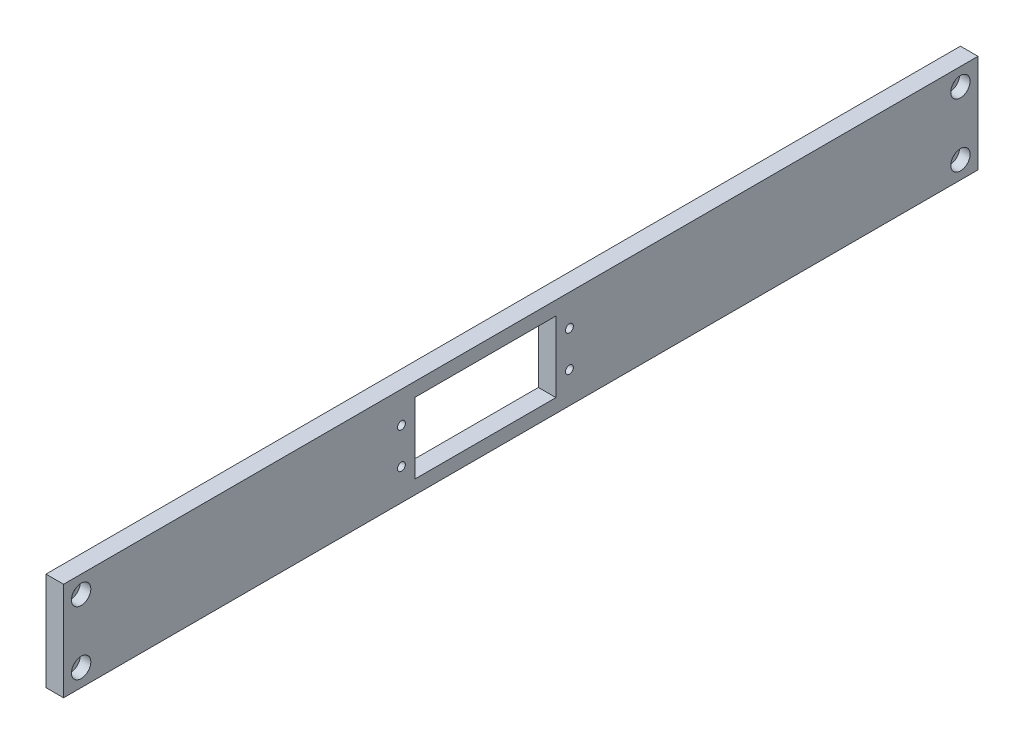
ISO-10303-21;
HEADER;
FILE_DESCRIPTION(('STEP AP214'),'2;1');
FILE_NAME('part.step','',(''),(''),'','','');
FILE_SCHEMA(('AUTOMOTIVE_DESIGN { 1 0 10303 214 1 1 1 1 }'));
ENDSEC;
DATA;
#1=APPLICATION_CONTEXT('core data for automotive mechanical design processes');
#2=APPLICATION_PROTOCOL_DEFINITION('international standard','automotive_design',2000,#1);
#3=PRODUCT_CONTEXT('',#1,'mechanical');
#4=PRODUCT('Part','Part','',(#3));
#5=PRODUCT_RELATED_PRODUCT_CATEGORY('part','',(#4));
#6=PRODUCT_DEFINITION_FORMATION('','',#4);
#7=PRODUCT_DEFINITION_CONTEXT('part definition',#1,'design');
#8=PRODUCT_DEFINITION('design','',#6,#7);
#9=PRODUCT_DEFINITION_SHAPE('','',#8);
#10=(LENGTH_UNIT() NAMED_UNIT(*) SI_UNIT(.MILLI.,.METRE.));
#11=(NAMED_UNIT(*) PLANE_ANGLE_UNIT() SI_UNIT($,.RADIAN.));
#12=(NAMED_UNIT(*) SI_UNIT($,.STERADIAN.) SOLID_ANGLE_UNIT());
#13=UNCERTAINTY_MEASURE_WITH_UNIT(LENGTH_MEASURE(1.E-05),#10,'distance_accuracy_value','');
#14=(GEOMETRIC_REPRESENTATION_CONTEXT(3) GLOBAL_UNCERTAINTY_ASSIGNED_CONTEXT((#13)) GLOBAL_UNIT_ASSIGNED_CONTEXT((#10,
#11,#12)) REPRESENTATION_CONTEXT('',''));
#15=CARTESIAN_POINT('',(0.,0.,0.));
#16=DIRECTION('',(0.,0.,1.));
#17=DIRECTION('',(1.,0.,0.));
#18=AXIS2_PLACEMENT_3D('',#15,#16,#17);
#19=CARTESIAN_POINT('',(2.49999999999998,28.,-130.1));
#20=DIRECTION('',(-1.,0.,0.));
#21=DIRECTION('',(0.,0.,1.));
#22=AXIS2_PLACEMENT_3D('',#19,#20,#21);
#23=PLANE('',#22);
#24=CARTESIAN_POINT('',(2.50000000000002,5.,-125.1));
#25=DIRECTION('',(1.,0.,0.));
#26=DIRECTION('',(0.,0.,1.));
#27=AXIS2_PLACEMENT_3D('',#24,#25,#26);
#28=CIRCLE('',#27,2.75000000000001);
#29=CARTESIAN_POINT('',(2.50000000000001,5.,-122.35));
#30=VERTEX_POINT('',#29);
#31=EDGE_CURVE('E297',#30,#30,#28,.T.);
#32=ORIENTED_EDGE('',*,*,#31,.F.);
#33=EDGE_LOOP('',(#32));
#34=FACE_BOUND('',#33,.T.);
#35=CARTESIAN_POINT('',(2.50000000000002,23.,-125.1));
#36=DIRECTION('',(-1.,0.,0.));
#37=DIRECTION('',(0.,0.,1.));
#38=AXIS2_PLACEMENT_3D('',#35,#36,#37);
#39=CIRCLE('',#38,2.75000000000001);
#40=CARTESIAN_POINT('',(2.50000000000001,23.,-122.35));
#41=VERTEX_POINT('',#40);
#42=EDGE_CURVE('E303',#41,#41,#39,.T.);
#43=ORIENTED_EDGE('',*,*,#42,.T.);
#44=EDGE_LOOP('',(#43));
#45=FACE_BOUND('',#44,.T.);
#46=CARTESIAN_POINT('',(2.50000000000002,5.,125.1));
#47=DIRECTION('',(-1.,0.,0.));
#48=DIRECTION('',(0.,0.,-1.));
#49=AXIS2_PLACEMENT_3D('',#46,#47,#48);
#50=CIRCLE('',#49,2.75000000000001);
#51=CARTESIAN_POINT('',(2.50000000000001,5.,122.35));
#52=VERTEX_POINT('',#51);
#53=EDGE_CURVE('E309',#52,#52,#50,.T.);
#54=ORIENTED_EDGE('',*,*,#53,.T.);
#55=EDGE_LOOP('',(#54));
#56=FACE_BOUND('',#55,.T.);
#57=CARTESIAN_POINT('',(2.50000000000002,23.,125.1));
#58=DIRECTION('',(1.,0.,0.));
#59=DIRECTION('',(0.,0.,-1.));
#60=AXIS2_PLACEMENT_3D('',#57,#58,#59);
#61=CIRCLE('',#60,2.75000000000001);
#62=CARTESIAN_POINT('',(2.50000000000001,23.,122.35));
#63=VERTEX_POINT('',#62);
#64=EDGE_CURVE('E321',#63,#63,#61,.T.);
#65=ORIENTED_EDGE('',*,*,#64,.F.);
#66=EDGE_LOOP('',(#65));
#67=FACE_BOUND('',#66,.T.);
#68=CARTESIAN_POINT('',(2.5,8.9,33.96));
#69=DIRECTION('',(1.,0.,0.));
#70=DIRECTION('',(0.,0.,-1.));
#71=AXIS2_PLACEMENT_3D('',#68,#69,#70);
#72=CIRCLE('',#71,1.125);
#73=CARTESIAN_POINT('',(2.5,8.9,32.835));
#74=VERTEX_POINT('',#73);
#75=EDGE_CURVE('E336',#74,#74,#72,.T.);
#76=ORIENTED_EDGE('',*,*,#75,.F.);
#77=EDGE_LOOP('',(#76));
#78=FACE_BOUND('',#77,.T.);
#79=CARTESIAN_POINT('',(2.5,19.1,-13.84));
#80=DIRECTION('',(1.,0.,0.));
#81=DIRECTION('',(0.,0.,-1.));
#82=AXIS2_PLACEMENT_3D('',#79,#80,#81);
#83=CIRCLE('',#82,1.125);
#84=CARTESIAN_POINT('',(2.5,19.1,-14.965));
#85=VERTEX_POINT('',#84);
#86=EDGE_CURVE('E342',#85,#85,#83,.T.);
#87=ORIENTED_EDGE('',*,*,#86,.F.);
#88=EDGE_LOOP('',(#87));
#89=FACE_BOUND('',#88,.T.);
#90=CARTESIAN_POINT('',(2.5,8.9,-13.84));
#91=DIRECTION('',(1.,0.,0.));
#92=DIRECTION('',(0.,0.,-1.));
#93=AXIS2_PLACEMENT_3D('',#90,#91,#92);
#94=CIRCLE('',#93,1.125);
#95=CARTESIAN_POINT('',(2.5,8.9,-14.965));
#96=VERTEX_POINT('',#95);
#97=EDGE_CURVE('E330',#96,#96,#94,.T.);
#98=ORIENTED_EDGE('',*,*,#97,.F.);
#99=EDGE_LOOP('',(#98));
#100=FACE_BOUND('',#99,.T.);
#101=CARTESIAN_POINT('',(2.5,19.1,33.96));
#102=DIRECTION('',(1.,0.,0.));
#103=DIRECTION('',(0.,0.,-1.));
#104=AXIS2_PLACEMENT_3D('',#101,#102,#103);
#105=CIRCLE('',#104,1.125);
#106=CARTESIAN_POINT('',(2.5,19.1,32.835));
#107=VERTEX_POINT('',#106);
#108=EDGE_CURVE('E127',#107,#107,#105,.T.);
#109=ORIENTED_EDGE('',*,*,#108,.F.);
#110=EDGE_LOOP('',(#109));
#111=FACE_BOUND('',#110,.T.);
#112=DIRECTION('',(0.,0.,1.));
#113=VECTOR('',#112,1.);
#114=CARTESIAN_POINT('',(2.5,24.06,30.12));
#115=LINE('',#114,#113);
#116=CARTESIAN_POINT('',(2.5,24.06,-9.99999999999999));
#117=VERTEX_POINT('',#116);
#118=CARTESIAN_POINT('',(2.5,24.06,30.12));
#119=VERTEX_POINT('',#118);
#120=EDGE_CURVE('E133',#117,#119,#115,.T.);
#121=ORIENTED_EDGE('',*,*,#120,.F.);
#122=DIRECTION('',(0.,1.,0.));
#123=VECTOR('',#122,1.);
#124=CARTESIAN_POINT('',(2.5,24.06,-10.));
#125=LINE('',#124,#123);
#126=CARTESIAN_POINT('',(2.5,3.94,-10.));
#127=VERTEX_POINT('',#126);
#128=EDGE_CURVE('E53',#127,#117,#125,.T.);
#129=ORIENTED_EDGE('',*,*,#128,.F.);
#130=DIRECTION('',(0.,0.,-1.));
#131=VECTOR('',#130,1.);
#132=CARTESIAN_POINT('',(2.5,3.94,30.12));
#133=LINE('',#132,#131);
#134=CARTESIAN_POINT('',(2.5,3.94,30.12));
#135=VERTEX_POINT('',#134);
#136=EDGE_CURVE('E121',#135,#127,#133,.T.);
#137=ORIENTED_EDGE('',*,*,#136,.F.);
#138=DIRECTION('',(0.,-1.,0.));
#139=VECTOR('',#138,1.);
#140=CARTESIAN_POINT('',(2.5,24.06,30.12));
#141=LINE('',#140,#139);
#142=EDGE_CURVE('E124',#119,#135,#141,.T.);
#143=ORIENTED_EDGE('',*,*,#142,.F.);
#144=EDGE_LOOP('',(#121,#129,#137,#143));
#145=FACE_BOUND('',#144,.T.);
#146=DIRECTION('',(0.,0.,-1.));
#147=VECTOR('',#146,1.);
#148=CARTESIAN_POINT('',(2.49999999999998,0.,-130.1));
#149=LINE('',#148,#147);
#150=CARTESIAN_POINT('',(2.50000000000002,0.,130.1));
#151=VERTEX_POINT('',#150);
#152=CARTESIAN_POINT('',(2.49999999999998,0.,-130.1));
#153=VERTEX_POINT('',#152);
#154=EDGE_CURVE('E140',#151,#153,#149,.T.);
#155=ORIENTED_EDGE('',*,*,#154,.T.);
#156=DIRECTION('',(0.,-1.,0.));
#157=VECTOR('',#156,1.);
#158=CARTESIAN_POINT('',(2.49999999999998,28.,-130.1));
#159=LINE('',#158,#157);
#160=CARTESIAN_POINT('',(2.49999999999998,28.,-130.1));
#161=VERTEX_POINT('',#160);
#162=EDGE_CURVE('E11',#161,#153,#159,.T.);
#163=ORIENTED_EDGE('',*,*,#162,.F.);
#164=DIRECTION('',(0.,0.,-1.));
#165=VECTOR('',#164,1.);
#166=CARTESIAN_POINT('',(2.49999999999998,28.,-130.1));
#167=LINE('',#166,#165);
#168=CARTESIAN_POINT('',(2.50000000000002,28.,130.1));
#169=VERTEX_POINT('',#168);
#170=EDGE_CURVE('E144',#169,#161,#167,.T.);
#171=ORIENTED_EDGE('',*,*,#170,.F.);
#172=DIRECTION('',(0.,-1.,0.));
#173=VECTOR('',#172,1.);
#174=CARTESIAN_POINT('',(2.50000000000002,28.,130.1));
#175=LINE('',#174,#173);
#176=EDGE_CURVE('E154',#169,#151,#175,.T.);
#177=ORIENTED_EDGE('',*,*,#176,.T.);
#178=EDGE_LOOP('',(#155,#163,#171,#177));
#179=FACE_BOUND('',#178,.T.);
#180=ADVANCED_FACE('F39',(#34,#45,#56,#67,#78,#89,#100,#111,#145,#179),#23,.F.);
#181=CARTESIAN_POINT('',(-2.50000000000002,28.,-130.1));
#182=DIRECTION('',(0.,0.,1.));
#183=DIRECTION('',(1.,0.,0.));
#184=AXIS2_PLACEMENT_3D('',#181,#182,#183);
#185=PLANE('',#184);
#186=DIRECTION('',(-1.,0.,0.));
#187=VECTOR('',#186,1.);
#188=CARTESIAN_POINT('',(-2.50000000000002,0.,-130.1));
#189=LINE('',#188,#187);
#190=CARTESIAN_POINT('',(-2.50000000000002,0.,-130.1));
#191=VERTEX_POINT('',#190);
#192=EDGE_CURVE('E157',#153,#191,#189,.T.);
#193=ORIENTED_EDGE('',*,*,#192,.T.);
#194=DIRECTION('',(0.,-1.,0.));
#195=VECTOR('',#194,1.);
#196=CARTESIAN_POINT('',(-2.50000000000002,28.,-130.1));
#197=LINE('',#196,#195);
#198=CARTESIAN_POINT('',(-2.50000000000002,28.,-130.1));
#199=VERTEX_POINT('',#198);
#200=EDGE_CURVE('E46',#199,#191,#197,.T.);
#201=ORIENTED_EDGE('',*,*,#200,.F.);
#202=DIRECTION('',(-1.,0.,0.));
#203=VECTOR('',#202,1.);
#204=CARTESIAN_POINT('',(-2.50000000000002,28.,-130.1));
#205=LINE('',#204,#203);
#206=EDGE_CURVE('E147',#161,#199,#205,.T.);
#207=ORIENTED_EDGE('',*,*,#206,.F.);
#208=ORIENTED_EDGE('',*,*,#162,.T.);
#209=EDGE_LOOP('',(#193,#201,#207,#208));
#210=FACE_BOUND('',#209,.T.);
#211=ADVANCED_FACE('F185',(#210),#185,.F.);
#212=CARTESIAN_POINT('',(-2.50000000000002,28.,-130.1));
#213=DIRECTION('',(1.,0.,0.));
#214=DIRECTION('',(0.,0.,-1.));
#215=AXIS2_PLACEMENT_3D('',#212,#213,#214);
#216=PLANE('',#215);
#217=CARTESIAN_POINT('',(-2.50000000000006,5.,-125.1));
#218=DIRECTION('',(1.,0.,0.));
#219=DIRECTION('',(0.,0.,1.));
#220=AXIS2_PLACEMENT_3D('',#217,#218,#219);
#221=CIRCLE('',#220,1.54999999999999);
#222=CARTESIAN_POINT('',(-2.50000000000006,5.,-123.55));
#223=VERTEX_POINT('',#222);
#224=EDGE_CURVE('E280',#223,#223,#221,.T.);
#225=ORIENTED_EDGE('',*,*,#224,.T.);
#226=EDGE_LOOP('',(#225));
#227=FACE_BOUND('',#226,.T.);
#228=CARTESIAN_POINT('',(-2.50000000000006,23.,-125.1));
#229=DIRECTION('',(-1.,0.,0.));
#230=DIRECTION('',(0.,0.,1.));
#231=AXIS2_PLACEMENT_3D('',#228,#229,#230);
#232=CIRCLE('',#231,1.54999999999999);
#233=CARTESIAN_POINT('',(-2.50000000000006,23.,-123.55));
#234=VERTEX_POINT('',#233);
#235=EDGE_CURVE('E288',#234,#234,#232,.T.);
#236=ORIENTED_EDGE('',*,*,#235,.F.);
#237=EDGE_LOOP('',(#236));
#238=FACE_BOUND('',#237,.T.);
#239=CARTESIAN_POINT('',(-2.50000000000006,5.,125.1));
#240=DIRECTION('',(-1.,0.,0.));
#241=DIRECTION('',(0.,0.,-1.));
#242=AXIS2_PLACEMENT_3D('',#239,#240,#241);
#243=CIRCLE('',#242,1.54999999999999);
#244=CARTESIAN_POINT('',(-2.50000000000006,5.,123.55));
#245=VERTEX_POINT('',#244);
#246=EDGE_CURVE('E294',#245,#245,#243,.T.);
#247=ORIENTED_EDGE('',*,*,#246,.F.);
#248=EDGE_LOOP('',(#247));
#249=FACE_BOUND('',#248,.T.);
#250=CARTESIAN_POINT('',(-2.50000000000005,23.,125.1));
#251=DIRECTION('',(1.,0.,0.));
#252=DIRECTION('',(0.,0.,-1.));
#253=AXIS2_PLACEMENT_3D('',#250,#251,#252);
#254=CIRCLE('',#253,1.54999999999999);
#255=CARTESIAN_POINT('',(-2.50000000000005,23.,123.55));
#256=VERTEX_POINT('',#255);
#257=EDGE_CURVE('E318',#256,#256,#254,.T.);
#258=ORIENTED_EDGE('',*,*,#257,.T.);
#259=EDGE_LOOP('',(#258));
#260=FACE_BOUND('',#259,.T.);
#261=CARTESIAN_POINT('',(-2.50000000000005,8.9,33.96));
#262=DIRECTION('',(1.,0.,0.));
#263=DIRECTION('',(0.,0.,-1.));
#264=AXIS2_PLACEMENT_3D('',#261,#262,#263);
#265=CIRCLE('',#264,1.125);
#266=CARTESIAN_POINT('',(-2.50000000000005,8.9,32.835));
#267=VERTEX_POINT('',#266);
#268=EDGE_CURVE('E339',#267,#267,#265,.T.);
#269=ORIENTED_EDGE('',*,*,#268,.T.);
#270=EDGE_LOOP('',(#269));
#271=FACE_BOUND('',#270,.T.);
#272=CARTESIAN_POINT('',(-2.50000000000005,19.1,-13.84));
#273=DIRECTION('',(1.,0.,0.));
#274=DIRECTION('',(0.,0.,-1.));
#275=AXIS2_PLACEMENT_3D('',#272,#273,#274);
#276=CIRCLE('',#275,1.125);
#277=CARTESIAN_POINT('',(-2.50000000000005,19.1,-14.965));
#278=VERTEX_POINT('',#277);
#279=EDGE_CURVE('E333',#278,#278,#276,.T.);
#280=ORIENTED_EDGE('',*,*,#279,.T.);
#281=EDGE_LOOP('',(#280));
#282=FACE_BOUND('',#281,.T.);
#283=CARTESIAN_POINT('',(-2.50000000000005,8.9,-13.84));
#284=DIRECTION('',(1.,0.,0.));
#285=DIRECTION('',(0.,0.,-1.));
#286=AXIS2_PLACEMENT_3D('',#283,#284,#285);
#287=CIRCLE('',#286,1.125);
#288=CARTESIAN_POINT('',(-2.50000000000005,8.9,-14.965));
#289=VERTEX_POINT('',#288);
#290=EDGE_CURVE('E327',#289,#289,#287,.T.);
#291=ORIENTED_EDGE('',*,*,#290,.T.);
#292=EDGE_LOOP('',(#291));
#293=FACE_BOUND('',#292,.T.);
#294=CARTESIAN_POINT('',(-2.50000000000005,19.1,33.96));
#295=DIRECTION('',(1.,0.,0.));
#296=DIRECTION('',(0.,0.,-1.));
#297=AXIS2_PLACEMENT_3D('',#294,#295,#296);
#298=CIRCLE('',#297,1.125);
#299=CARTESIAN_POINT('',(-2.50000000000005,19.1,32.835));
#300=VERTEX_POINT('',#299);
#301=EDGE_CURVE('E134',#300,#300,#298,.T.);
#302=ORIENTED_EDGE('',*,*,#301,.T.);
#303=EDGE_LOOP('',(#302));
#304=FACE_BOUND('',#303,.T.);
#305=DIRECTION('',(0.,0.,-1.));
#306=VECTOR('',#305,1.);
#307=CARTESIAN_POINT('',(-2.50000000000003,3.94,30.12));
#308=LINE('',#307,#306);
#309=CARTESIAN_POINT('',(-2.50000000000003,3.94,30.12));
#310=VERTEX_POINT('',#309);
#311=CARTESIAN_POINT('',(-2.50000000000003,3.94,-10.));
#312=VERTEX_POINT('',#311);
#313=EDGE_CURVE('E111',#310,#312,#308,.T.);
#314=ORIENTED_EDGE('',*,*,#313,.T.);
#315=DIRECTION('',(0.,1.,0.));
#316=VECTOR('',#315,1.);
#317=CARTESIAN_POINT('',(-2.50000000000003,24.06,-10.));
#318=LINE('',#317,#316);
#319=CARTESIAN_POINT('',(-2.50000000000003,24.06,-10.));
#320=VERTEX_POINT('',#319);
#321=EDGE_CURVE('E105',#312,#320,#318,.T.);
#322=ORIENTED_EDGE('',*,*,#321,.T.);
#323=DIRECTION('',(0.,0.,1.));
#324=VECTOR('',#323,1.);
#325=CARTESIAN_POINT('',(-2.50000000000003,24.06,30.12));
#326=LINE('',#325,#324);
#327=CARTESIAN_POINT('',(-2.49999999999999,24.06,30.12));
#328=VERTEX_POINT('',#327);
#329=EDGE_CURVE('E114',#320,#328,#326,.T.);
#330=ORIENTED_EDGE('',*,*,#329,.T.);
#331=DIRECTION('',(0.,-1.,0.));
#332=VECTOR('',#331,1.);
#333=CARTESIAN_POINT('',(-2.50000000000003,24.06,30.12));
#334=LINE('',#333,#332);
#335=EDGE_CURVE('E61',#328,#310,#334,.T.);
#336=ORIENTED_EDGE('',*,*,#335,.T.);
#337=EDGE_LOOP('',(#314,#322,#330,#336));
#338=FACE_BOUND('',#337,.T.);
#339=DIRECTION('',(0.,0.,1.));
#340=VECTOR('',#339,1.);
#341=CARTESIAN_POINT('',(-2.50000000000002,0.,-130.1));
#342=LINE('',#341,#340);
#343=CARTESIAN_POINT('',(-2.49999999999998,0.,130.1));
#344=VERTEX_POINT('',#343);
#345=EDGE_CURVE('E159',#191,#344,#342,.T.);
#346=ORIENTED_EDGE('',*,*,#345,.T.);
#347=DIRECTION('',(0.,-1.,0.));
#348=VECTOR('',#347,1.);
#349=CARTESIAN_POINT('',(-2.49999999999998,28.,130.1));
#350=LINE('',#349,#348);
#351=CARTESIAN_POINT('',(-2.49999999999998,28.,130.1));
#352=VERTEX_POINT('',#351);
#353=EDGE_CURVE('E164',#352,#344,#350,.T.);
#354=ORIENTED_EDGE('',*,*,#353,.F.);
#355=DIRECTION('',(0.,0.,1.));
#356=VECTOR('',#355,1.);
#357=CARTESIAN_POINT('',(-2.50000000000002,28.,-130.1));
#358=LINE('',#357,#356);
#359=EDGE_CURVE('E150',#199,#352,#358,.T.);
#360=ORIENTED_EDGE('',*,*,#359,.F.);
#361=ORIENTED_EDGE('',*,*,#200,.T.);
#362=EDGE_LOOP('',(#346,#354,#360,#361));
#363=FACE_BOUND('',#362,.T.);
#364=ADVANCED_FACE('F118',(#227,#238,#249,#260,#271,#282,#293,#304,#338,#363),#216,.F.);
#365=CARTESIAN_POINT('',(-2.49999999999998,28.,130.1));
#366=DIRECTION('',(0.,0.,-1.));
#367=DIRECTION('',(-1.,0.,0.));
#368=AXIS2_PLACEMENT_3D('',#365,#366,#367);
#369=PLANE('',#368);
#370=DIRECTION('',(1.,0.,0.));
#371=VECTOR('',#370,1.);
#372=CARTESIAN_POINT('',(-2.49999999999998,0.,130.1));
#373=LINE('',#372,#371);
#374=EDGE_CURVE('E148',#344,#151,#373,.T.);
#375=ORIENTED_EDGE('',*,*,#374,.T.);
#376=ORIENTED_EDGE('',*,*,#176,.F.);
#377=DIRECTION('',(1.,0.,0.));
#378=VECTOR('',#377,1.);
#379=CARTESIAN_POINT('',(-2.49999999999998,28.,130.1));
#380=LINE('',#379,#378);
#381=EDGE_CURVE('E152',#352,#169,#380,.T.);
#382=ORIENTED_EDGE('',*,*,#381,.F.);
#383=ORIENTED_EDGE('',*,*,#353,.T.);
#384=EDGE_LOOP('',(#375,#376,#382,#383));
#385=FACE_BOUND('',#384,.T.);
#386=ADVANCED_FACE('F178',(#385),#369,.F.);
#387=CARTESIAN_POINT('',(0.,28.,0.));
#388=DIRECTION('',(0.,1.,0.));
#389=DIRECTION('',(0.,0.,1.));
#390=AXIS2_PLACEMENT_3D('',#387,#388,#389);
#391=PLANE('',#390);
#392=ORIENTED_EDGE('',*,*,#170,.T.);
#393=ORIENTED_EDGE('',*,*,#206,.T.);
#394=ORIENTED_EDGE('',*,*,#359,.T.);
#395=ORIENTED_EDGE('',*,*,#381,.T.);
#396=EDGE_LOOP('',(#392,#393,#394,#395));
#397=FACE_BOUND('',#396,.T.);
#398=ADVANCED_FACE('F184',(#397),#391,.T.);
#399=CARTESIAN_POINT('',(0.,0.,0.));
#400=DIRECTION('',(0.,1.,0.));
#401=DIRECTION('',(0.,0.,1.));
#402=AXIS2_PLACEMENT_3D('',#399,#400,#401);
#403=PLANE('',#402);
#404=ORIENTED_EDGE('',*,*,#154,.F.);
#405=ORIENTED_EDGE('',*,*,#374,.F.);
#406=ORIENTED_EDGE('',*,*,#345,.F.);
#407=ORIENTED_EDGE('',*,*,#192,.F.);
#408=EDGE_LOOP('',(#404,#405,#406,#407));
#409=FACE_BOUND('',#408,.T.);
#410=ADVANCED_FACE('F175',(#409),#403,.F.);
#411=CARTESIAN_POINT('',(-2.50000000000003,24.06,-10.));
#412=DIRECTION('',(0.,0.,-1.));
#413=DIRECTION('',(-1.,0.,0.));
#414=AXIS2_PLACEMENT_3D('',#411,#412,#413);
#415=PLANE('',#414);
#416=ORIENTED_EDGE('',*,*,#128,.T.);
#417=DIRECTION('',(1.,0.,0.));
#418=VECTOR('',#417,1.);
#419=CARTESIAN_POINT('',(-2.50000000000003,24.06,-10.));
#420=LINE('',#419,#418);
#421=EDGE_CURVE('E101',#320,#117,#420,.T.);
#422=ORIENTED_EDGE('',*,*,#421,.F.);
#423=ORIENTED_EDGE('',*,*,#321,.F.);
#424=DIRECTION('',(1.,0.,0.));
#425=VECTOR('',#424,1.);
#426=CARTESIAN_POINT('',(-2.50000000000003,3.94,-10.));
#427=LINE('',#426,#425);
#428=EDGE_CURVE('E138',#312,#127,#427,.T.);
#429=ORIENTED_EDGE('',*,*,#428,.T.);
#430=EDGE_LOOP('',(#416,#422,#423,#429));
#431=FACE_BOUND('',#430,.T.);
#432=ADVANCED_FACE('F103',(#431),#415,.F.);
#433=CARTESIAN_POINT('',(-2.50000000000003,3.94,30.12));
#434=DIRECTION('',(0.,-1.,0.));
#435=DIRECTION('',(0.,0.,-1.));
#436=AXIS2_PLACEMENT_3D('',#433,#434,#435);
#437=PLANE('',#436);
#438=ORIENTED_EDGE('',*,*,#136,.T.);
#439=ORIENTED_EDGE('',*,*,#428,.F.);
#440=ORIENTED_EDGE('',*,*,#313,.F.);
#441=DIRECTION('',(1.,0.,0.));
#442=VECTOR('',#441,1.);
#443=CARTESIAN_POINT('',(-2.50000000000003,3.94,30.12));
#444=LINE('',#443,#442);
#445=EDGE_CURVE('E141',#310,#135,#444,.T.);
#446=ORIENTED_EDGE('',*,*,#445,.T.);
#447=EDGE_LOOP('',(#438,#439,#440,#446));
#448=FACE_BOUND('',#447,.T.);
#449=ADVANCED_FACE('F203',(#448),#437,.F.);
#450=CARTESIAN_POINT('',(-2.50000000000003,24.06,30.12));
#451=DIRECTION('',(0.,0.,1.));
#452=DIRECTION('',(0.,-1.,0.));
#453=AXIS2_PLACEMENT_3D('',#450,#451,#452);
#454=PLANE('',#453);
#455=ORIENTED_EDGE('',*,*,#142,.T.);
#456=ORIENTED_EDGE('',*,*,#445,.F.);
#457=ORIENTED_EDGE('',*,*,#335,.F.);
#458=DIRECTION('',(1.,0.,0.));
#459=VECTOR('',#458,1.);
#460=CARTESIAN_POINT('',(-2.50000000000003,24.06,30.12));
#461=LINE('',#460,#459);
#462=EDGE_CURVE('E110',#328,#119,#461,.T.);
#463=ORIENTED_EDGE('',*,*,#462,.T.);
#464=EDGE_LOOP('',(#455,#456,#457,#463));
#465=FACE_BOUND('',#464,.T.);
#466=ADVANCED_FACE('F207',(#465),#454,.F.);
#467=CARTESIAN_POINT('',(-2.50000000000003,24.06,30.12));
#468=DIRECTION('',(0.,1.,0.));
#469=DIRECTION('',(0.,0.,1.));
#470=AXIS2_PLACEMENT_3D('',#467,#468,#469);
#471=PLANE('',#470);
#472=ORIENTED_EDGE('',*,*,#120,.T.);
#473=ORIENTED_EDGE('',*,*,#462,.F.);
#474=ORIENTED_EDGE('',*,*,#329,.F.);
#475=ORIENTED_EDGE('',*,*,#421,.T.);
#476=EDGE_LOOP('',(#472,#473,#474,#475));
#477=FACE_BOUND('',#476,.T.);
#478=ADVANCED_FACE('F115',(#477),#471,.F.);
#479=CARTESIAN_POINT('',(-2.50000000000005,19.1,33.96));
#480=DIRECTION('',(1.,0.,0.));
#481=DIRECTION('',(0.,0.,-1.));
#482=AXIS2_PLACEMENT_3D('',#479,#480,#481);
#483=CYLINDRICAL_SURFACE('',#482,1.125);
#484=ORIENTED_EDGE('',*,*,#301,.F.);
#485=EDGE_LOOP('',(#484));
#486=FACE_BOUND('',#485,.T.);
#487=ORIENTED_EDGE('',*,*,#108,.T.);
#488=EDGE_LOOP('',(#487));
#489=FACE_BOUND('',#488,.T.);
#490=ADVANCED_FACE('F206',(#486,#489),#483,.F.);
#491=CARTESIAN_POINT('',(-2.50000000000005,8.9,-13.84));
#492=DIRECTION('',(1.,0.,0.));
#493=DIRECTION('',(0.,0.,-1.));
#494=AXIS2_PLACEMENT_3D('',#491,#492,#493);
#495=CYLINDRICAL_SURFACE('',#494,1.125);
#496=ORIENTED_EDGE('',*,*,#290,.F.);
#497=EDGE_LOOP('',(#496));
#498=FACE_BOUND('',#497,.T.);
#499=ORIENTED_EDGE('',*,*,#97,.T.);
#500=EDGE_LOOP('',(#499));
#501=FACE_BOUND('',#500,.T.);
#502=ADVANCED_FACE('F215',(#498,#501),#495,.F.);
#503=CARTESIAN_POINT('',(-2.50000000000005,19.1,-13.84));
#504=DIRECTION('',(1.,0.,0.));
#505=DIRECTION('',(0.,0.,-1.));
#506=AXIS2_PLACEMENT_3D('',#503,#504,#505);
#507=CYLINDRICAL_SURFACE('',#506,1.125);
#508=ORIENTED_EDGE('',*,*,#279,.F.);
#509=EDGE_LOOP('',(#508));
#510=FACE_BOUND('',#509,.T.);
#511=ORIENTED_EDGE('',*,*,#86,.T.);
#512=EDGE_LOOP('',(#511));
#513=FACE_BOUND('',#512,.T.);
#514=ADVANCED_FACE('F217',(#510,#513),#507,.F.);
#515=CARTESIAN_POINT('',(-2.50000000000005,8.9,33.96));
#516=DIRECTION('',(1.,0.,0.));
#517=DIRECTION('',(0.,0.,-1.));
#518=AXIS2_PLACEMENT_3D('',#515,#516,#517);
#519=CYLINDRICAL_SURFACE('',#518,1.125);
#520=ORIENTED_EDGE('',*,*,#268,.F.);
#521=EDGE_LOOP('',(#520));
#522=FACE_BOUND('',#521,.T.);
#523=ORIENTED_EDGE('',*,*,#75,.T.);
#524=EDGE_LOOP('',(#523));
#525=FACE_BOUND('',#524,.T.);
#526=ADVANCED_FACE('F220',(#522,#525),#519,.F.);
#527=CARTESIAN_POINT('',(-0.499999999999985,23.,125.1));
#528=DIRECTION('',(1.,0.,0.));
#529=DIRECTION('',(0.,0.,-1.));
#530=AXIS2_PLACEMENT_3D('',#527,#528,#529);
#531=CYLINDRICAL_SURFACE('',#530,2.75000000000001);
#532=CARTESIAN_POINT('',(-0.499999999999985,23.,125.1));
#533=DIRECTION('',(1.,0.,0.));
#534=DIRECTION('',(0.,0.,-1.));
#535=AXIS2_PLACEMENT_3D('',#532,#533,#534);
#536=CIRCLE('',#535,2.75000000000001);
#537=CARTESIAN_POINT('',(-0.499999999999985,23.,122.35));
#538=VERTEX_POINT('',#537);
#539=EDGE_CURVE('E324',#538,#538,#536,.T.);
#540=ORIENTED_EDGE('',*,*,#539,.F.);
#541=EDGE_LOOP('',(#540));
#542=FACE_BOUND('',#541,.T.);
#543=ORIENTED_EDGE('',*,*,#64,.T.);
#544=EDGE_LOOP('',(#543));
#545=FACE_BOUND('',#544,.T.);
#546=ADVANCED_FACE('F224',(#542,#545),#531,.F.);
#547=CARTESIAN_POINT('',(-0.499999999999985,23.,125.1));
#548=DIRECTION('',(1.,0.,0.));
#549=DIRECTION('',(0.,0.,-1.));
#550=AXIS2_PLACEMENT_3D('',#547,#548,#549);
#551=PLANE('',#550);
#552=CARTESIAN_POINT('',(-0.499999999999985,23.,125.1));
#553=DIRECTION('',(1.,0.,0.));
#554=DIRECTION('',(0.,0.,-1.));
#555=AXIS2_PLACEMENT_3D('',#552,#553,#554);
#556=CIRCLE('',#555,1.54999999999999);
#557=CARTESIAN_POINT('',(-0.499999999999985,23.,123.55));
#558=VERTEX_POINT('',#557);
#559=EDGE_CURVE('E315',#558,#558,#556,.T.);
#560=ORIENTED_EDGE('',*,*,#559,.F.);
#561=EDGE_LOOP('',(#560));
#562=FACE_BOUND('',#561,.T.);
#563=ORIENTED_EDGE('',*,*,#539,.T.);
#564=EDGE_LOOP('',(#563));
#565=FACE_BOUND('',#564,.T.);
#566=ADVANCED_FACE('F231',(#562,#565),#551,.T.);
#567=CARTESIAN_POINT('',(-2.50000000000005,23.,125.1));
#568=DIRECTION('',(1.,0.,0.));
#569=DIRECTION('',(0.,0.,-1.));
#570=AXIS2_PLACEMENT_3D('',#567,#568,#569);
#571=CYLINDRICAL_SURFACE('',#570,1.54999999999999);
#572=ORIENTED_EDGE('',*,*,#257,.F.);
#573=EDGE_LOOP('',(#572));
#574=FACE_BOUND('',#573,.T.);
#575=ORIENTED_EDGE('',*,*,#559,.T.);
#576=EDGE_LOOP('',(#575));
#577=FACE_BOUND('',#576,.T.);
#578=ADVANCED_FACE('F235',(#574,#577),#571,.F.);
#579=CARTESIAN_POINT('',(-0.499999999999985,5.,125.1));
#580=DIRECTION('',(1.,0.,0.));
#581=DIRECTION('',(0.,0.,-1.));
#582=AXIS2_PLACEMENT_3D('',#579,#580,#581);
#583=CYLINDRICAL_SURFACE('',#582,2.75000000000001);
#584=CARTESIAN_POINT('',(-0.499999999999985,5.,125.1));
#585=DIRECTION('',(-1.,0.,0.));
#586=DIRECTION('',(0.,0.,-1.));
#587=AXIS2_PLACEMENT_3D('',#584,#585,#586);
#588=CIRCLE('',#587,2.75000000000001);
#589=CARTESIAN_POINT('',(-0.499999999999985,5.,122.35));
#590=VERTEX_POINT('',#589);
#591=EDGE_CURVE('E312',#590,#590,#588,.T.);
#592=ORIENTED_EDGE('',*,*,#591,.T.);
#593=EDGE_LOOP('',(#592));
#594=FACE_BOUND('',#593,.T.);
#595=ORIENTED_EDGE('',*,*,#53,.F.);
#596=EDGE_LOOP('',(#595));
#597=FACE_BOUND('',#596,.T.);
#598=ADVANCED_FACE('F239',(#594,#597),#583,.F.);
#599=CARTESIAN_POINT('',(-0.499999999999985,5.,125.1));
#600=DIRECTION('',(1.,0.,0.));
#601=DIRECTION('',(0.,0.,-1.));
#602=AXIS2_PLACEMENT_3D('',#599,#600,#601);
#603=PLANE('',#602);
#604=CARTESIAN_POINT('',(-0.499999999999985,5.,125.1));
#605=DIRECTION('',(-1.,0.,0.));
#606=DIRECTION('',(0.,0.,-1.));
#607=AXIS2_PLACEMENT_3D('',#604,#605,#606);
#608=CIRCLE('',#607,1.54999999999999);
#609=CARTESIAN_POINT('',(-0.499999999999985,5.,123.55));
#610=VERTEX_POINT('',#609);
#611=EDGE_CURVE('E291',#610,#610,#608,.T.);
#612=ORIENTED_EDGE('',*,*,#611,.T.);
#613=EDGE_LOOP('',(#612));
#614=FACE_BOUND('',#613,.T.);
#615=ORIENTED_EDGE('',*,*,#591,.F.);
#616=EDGE_LOOP('',(#615));
#617=FACE_BOUND('',#616,.T.);
#618=ADVANCED_FACE('F243',(#614,#617),#603,.T.);
#619=CARTESIAN_POINT('',(-0.499999999999985,23.,-125.1));
#620=DIRECTION('',(1.,0.,0.));
#621=DIRECTION('',(0.,0.,-1.));
#622=AXIS2_PLACEMENT_3D('',#619,#620,#621);
#623=CYLINDRICAL_SURFACE('',#622,2.75000000000001);
#624=CARTESIAN_POINT('',(-0.499999999999985,23.,-125.1));
#625=DIRECTION('',(-1.,0.,0.));
#626=DIRECTION('',(0.,0.,1.));
#627=AXIS2_PLACEMENT_3D('',#624,#625,#626);
#628=CIRCLE('',#627,2.75000000000001);
#629=CARTESIAN_POINT('',(-0.499999999999985,23.,-122.35));
#630=VERTEX_POINT('',#629);
#631=EDGE_CURVE('E306',#630,#630,#628,.T.);
#632=ORIENTED_EDGE('',*,*,#631,.T.);
#633=EDGE_LOOP('',(#632));
#634=FACE_BOUND('',#633,.T.);
#635=ORIENTED_EDGE('',*,*,#42,.F.);
#636=EDGE_LOOP('',(#635));
#637=FACE_BOUND('',#636,.T.);
#638=ADVANCED_FACE('F247',(#634,#637),#623,.F.);
#639=CARTESIAN_POINT('',(-0.499999999999985,23.,-125.1));
#640=DIRECTION('',(1.,0.,0.));
#641=DIRECTION('',(0.,0.,1.));
#642=AXIS2_PLACEMENT_3D('',#639,#640,#641);
#643=PLANE('',#642);
#644=CARTESIAN_POINT('',(-0.499999999999985,23.,-125.1));
#645=DIRECTION('',(-1.,0.,0.));
#646=DIRECTION('',(0.,0.,1.));
#647=AXIS2_PLACEMENT_3D('',#644,#645,#646);
#648=CIRCLE('',#647,1.54999999999999);
#649=CARTESIAN_POINT('',(-0.499999999999985,23.,-123.55));
#650=VERTEX_POINT('',#649);
#651=EDGE_CURVE('E285',#650,#650,#648,.T.);
#652=ORIENTED_EDGE('',*,*,#651,.T.);
#653=EDGE_LOOP('',(#652));
#654=FACE_BOUND('',#653,.T.);
#655=ORIENTED_EDGE('',*,*,#631,.F.);
#656=EDGE_LOOP('',(#655));
#657=FACE_BOUND('',#656,.T.);
#658=ADVANCED_FACE('F251',(#654,#657),#643,.T.);
#659=CARTESIAN_POINT('',(-0.499999999999985,5.,-125.1));
#660=DIRECTION('',(1.,0.,0.));
#661=DIRECTION('',(0.,0.,-1.));
#662=AXIS2_PLACEMENT_3D('',#659,#660,#661);
#663=CYLINDRICAL_SURFACE('',#662,2.75000000000001);
#664=CARTESIAN_POINT('',(-0.499999999999985,5.,-125.1));
#665=DIRECTION('',(1.,0.,0.));
#666=DIRECTION('',(0.,0.,1.));
#667=AXIS2_PLACEMENT_3D('',#664,#665,#666);
#668=CIRCLE('',#667,2.75000000000001);
#669=CARTESIAN_POINT('',(-0.499999999999985,5.,-122.35));
#670=VERTEX_POINT('',#669);
#671=EDGE_CURVE('E300',#670,#670,#668,.T.);
#672=ORIENTED_EDGE('',*,*,#671,.F.);
#673=EDGE_LOOP('',(#672));
#674=FACE_BOUND('',#673,.T.);
#675=ORIENTED_EDGE('',*,*,#31,.T.);
#676=EDGE_LOOP('',(#675));
#677=FACE_BOUND('',#676,.T.);
#678=ADVANCED_FACE('F255',(#674,#677),#663,.F.);
#679=CARTESIAN_POINT('',(-0.499999999999985,5.,-125.1));
#680=DIRECTION('',(1.,0.,0.));
#681=DIRECTION('',(0.,0.,1.));
#682=AXIS2_PLACEMENT_3D('',#679,#680,#681);
#683=PLANE('',#682);
#684=CARTESIAN_POINT('',(-0.499999999999985,5.,-125.1));
#685=DIRECTION('',(1.,0.,0.));
#686=DIRECTION('',(0.,0.,1.));
#687=AXIS2_PLACEMENT_3D('',#684,#685,#686);
#688=CIRCLE('',#687,1.54999999999999);
#689=CARTESIAN_POINT('',(-0.499999999999985,5.,-123.55));
#690=VERTEX_POINT('',#689);
#691=EDGE_CURVE('E283',#690,#690,#688,.T.);
#692=ORIENTED_EDGE('',*,*,#691,.F.);
#693=EDGE_LOOP('',(#692));
#694=FACE_BOUND('',#693,.T.);
#695=ORIENTED_EDGE('',*,*,#671,.T.);
#696=EDGE_LOOP('',(#695));
#697=FACE_BOUND('',#696,.T.);
#698=ADVANCED_FACE('F259',(#694,#697),#683,.T.);
#699=CARTESIAN_POINT('',(-2.50000000000006,5.,125.1));
#700=DIRECTION('',(1.,0.,0.));
#701=DIRECTION('',(0.,0.,-1.));
#702=AXIS2_PLACEMENT_3D('',#699,#700,#701);
#703=CYLINDRICAL_SURFACE('',#702,1.54999999999999);
#704=ORIENTED_EDGE('',*,*,#246,.T.);
#705=EDGE_LOOP('',(#704));
#706=FACE_BOUND('',#705,.T.);
#707=ORIENTED_EDGE('',*,*,#611,.F.);
#708=EDGE_LOOP('',(#707));
#709=FACE_BOUND('',#708,.T.);
#710=ADVANCED_FACE('F263',(#706,#709),#703,.F.);
#711=CARTESIAN_POINT('',(-2.50000000000006,23.,-125.1));
#712=DIRECTION('',(1.,0.,0.));
#713=DIRECTION('',(0.,0.,-1.));
#714=AXIS2_PLACEMENT_3D('',#711,#712,#713);
#715=CYLINDRICAL_SURFACE('',#714,1.54999999999999);
#716=ORIENTED_EDGE('',*,*,#235,.T.);
#717=EDGE_LOOP('',(#716));
#718=FACE_BOUND('',#717,.T.);
#719=ORIENTED_EDGE('',*,*,#651,.F.);
#720=EDGE_LOOP('',(#719));
#721=FACE_BOUND('',#720,.T.);
#722=ADVANCED_FACE('F267',(#718,#721),#715,.F.);
#723=CARTESIAN_POINT('',(-2.50000000000006,5.,-125.1));
#724=DIRECTION('',(1.,0.,0.));
#725=DIRECTION('',(0.,0.,-1.));
#726=AXIS2_PLACEMENT_3D('',#723,#724,#725);
#727=CYLINDRICAL_SURFACE('',#726,1.54999999999999);
#728=ORIENTED_EDGE('',*,*,#224,.F.);
#729=EDGE_LOOP('',(#728));
#730=FACE_BOUND('',#729,.T.);
#731=ORIENTED_EDGE('',*,*,#691,.T.);
#732=EDGE_LOOP('',(#731));
#733=FACE_BOUND('',#732,.T.);
#734=ADVANCED_FACE('F271',(#730,#733),#727,.F.);
#735=CLOSED_SHELL('',(#180,#211,#364,#386,#398,#410,#432,#449,#466,#478,#490,#502,#514,#526,
#546,#566,#578,#598,#618,#638,#658,#678,#698,#710,#722,#734));
#736=MANIFOLD_SOLID_BREP('B2',#735);
#737=ADVANCED_BREP_SHAPE_REPRESENTATION('',(#18,#736),#14);
#738=SHAPE_DEFINITION_REPRESENTATION(#9,#737);
ENDSEC;
END-ISO-10303-21;
